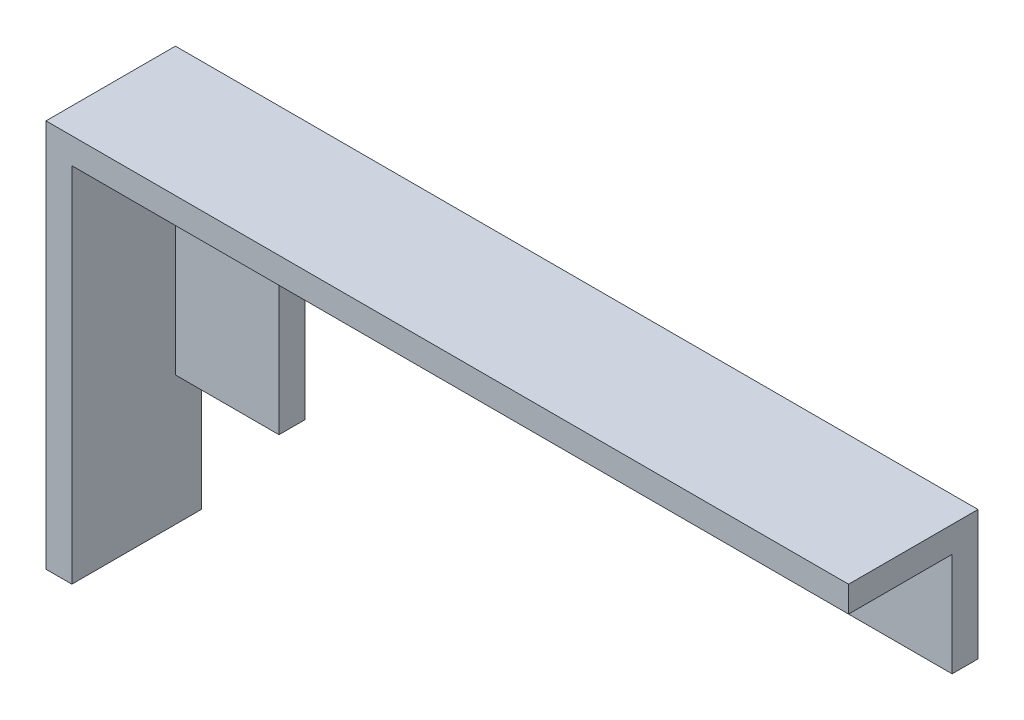
ISO-10303-21;
HEADER;
FILE_DESCRIPTION(('STEP AP214'),'2;1');
FILE_NAME('part.step','',(''),(''),'','','');
FILE_SCHEMA(('AUTOMOTIVE_DESIGN { 1 0 10303 214 1 1 1 1 }'));
ENDSEC;
DATA;
#1=APPLICATION_CONTEXT('core data for automotive mechanical design processes');
#2=APPLICATION_PROTOCOL_DEFINITION('international standard','automotive_design',2000,#1);
#3=PRODUCT_CONTEXT('',#1,'mechanical');
#4=PRODUCT('Part','Part','',(#3));
#5=PRODUCT_RELATED_PRODUCT_CATEGORY('part','',(#4));
#6=PRODUCT_DEFINITION_FORMATION('','',#4);
#7=PRODUCT_DEFINITION_CONTEXT('part definition',#1,'design');
#8=PRODUCT_DEFINITION('design','',#6,#7);
#9=PRODUCT_DEFINITION_SHAPE('','',#8);
#10=(LENGTH_UNIT() NAMED_UNIT(*) SI_UNIT(.MILLI.,.METRE.));
#11=(NAMED_UNIT(*) PLANE_ANGLE_UNIT() SI_UNIT($,.RADIAN.));
#12=(NAMED_UNIT(*) SI_UNIT($,.STERADIAN.) SOLID_ANGLE_UNIT());
#13=UNCERTAINTY_MEASURE_WITH_UNIT(LENGTH_MEASURE(1.E-05),#10,'distance_accuracy_value','');
#14=(GEOMETRIC_REPRESENTATION_CONTEXT(3) GLOBAL_UNCERTAINTY_ASSIGNED_CONTEXT((#13)) GLOBAL_UNIT_ASSIGNED_CONTEXT((#10,
#11,#12)) REPRESENTATION_CONTEXT('',''));
#15=CARTESIAN_POINT('',(0.,0.,0.));
#16=DIRECTION('',(0.,0.,1.));
#17=DIRECTION('',(1.,0.,0.));
#18=AXIS2_PLACEMENT_3D('',#15,#16,#17);
#19=CARTESIAN_POINT('',(0.,0.,5.));
#20=DIRECTION('',(1.,0.,0.));
#21=DIRECTION('',(0.,1.,0.));
#22=AXIS2_PLACEMENT_3D('',#19,#20,#21);
#23=PLANE('',#22);
#24=DIRECTION('',(0.,-1.,0.));
#25=VECTOR('',#24,1.);
#26=CARTESIAN_POINT('',(0.,0.,0.));
#27=LINE('',#26,#25);
#28=CARTESIAN_POINT('',(0.,0.,0.));
#29=VERTEX_POINT('',#28);
#30=CARTESIAN_POINT('',(0.,-15.,0.));
#31=VERTEX_POINT('',#30);
#32=EDGE_CURVE('E182',#29,#31,#27,.T.);
#33=ORIENTED_EDGE('',*,*,#32,.T.);
#34=DIRECTION('',(0.,0.,-1.));
#35=VECTOR('',#34,1.);
#36=CARTESIAN_POINT('',(0.,-15.,5.));
#37=LINE('',#36,#35);
#38=CARTESIAN_POINT('',(0.,-15.,5.));
#39=VERTEX_POINT('',#38);
#40=EDGE_CURVE('E11',#39,#31,#37,.T.);
#41=ORIENTED_EDGE('',*,*,#40,.F.);
#42=DIRECTION('',(0.,-1.,0.));
#43=VECTOR('',#42,1.);
#44=CARTESIAN_POINT('',(0.,0.,5.));
#45=LINE('',#44,#43);
#46=CARTESIAN_POINT('',(0.,0.,5.));
#47=VERTEX_POINT('',#46);
#48=EDGE_CURVE('E197',#47,#39,#45,.T.);
#49=ORIENTED_EDGE('',*,*,#48,.F.);
#50=DIRECTION('',(0.,0.,-1.));
#51=VECTOR('',#50,1.);
#52=CARTESIAN_POINT('',(0.,0.,5.));
#53=LINE('',#52,#51);
#54=EDGE_CURVE('E198',#47,#29,#53,.T.);
#55=ORIENTED_EDGE('',*,*,#54,.T.);
#56=EDGE_LOOP('',(#33,#41,#49,#55));
#57=FACE_BOUND('',#56,.T.);
#58=ADVANCED_FACE('F39',(#57),#23,.F.);
#59=CARTESIAN_POINT('',(0.,-15.,5.));
#60=DIRECTION('',(0.,1.,0.));
#61=DIRECTION('',(0.,0.,1.));
#62=AXIS2_PLACEMENT_3D('',#59,#60,#61);
#63=PLANE('',#62);
#64=DIRECTION('',(1.,0.,0.));
#65=VECTOR('',#64,1.);
#66=CARTESIAN_POINT('',(0.,-15.,0.));
#67=LINE('',#66,#65);
#68=CARTESIAN_POINT('',(1.,-15.,0.));
#69=VERTEX_POINT('',#68);
#70=EDGE_CURVE('E175',#31,#69,#67,.T.);
#71=ORIENTED_EDGE('',*,*,#70,.T.);
#72=DIRECTION('',(0.,0.,-1.));
#73=VECTOR('',#72,1.);
#74=CARTESIAN_POINT('',(1.,-15.,5.));
#75=LINE('',#74,#73);
#76=CARTESIAN_POINT('',(1.,-15.,5.));
#77=VERTEX_POINT('',#76);
#78=EDGE_CURVE('E47',#77,#69,#75,.T.);
#79=ORIENTED_EDGE('',*,*,#78,.F.);
#80=DIRECTION('',(1.,0.,0.));
#81=VECTOR('',#80,1.);
#82=CARTESIAN_POINT('',(0.,-15.,5.));
#83=LINE('',#82,#81);
#84=EDGE_CURVE('E103',#39,#77,#83,.T.);
#85=ORIENTED_EDGE('',*,*,#84,.F.);
#86=ORIENTED_EDGE('',*,*,#40,.T.);
#87=EDGE_LOOP('',(#71,#79,#85,#86));
#88=FACE_BOUND('',#87,.T.);
#89=ADVANCED_FACE('F259',(#88),#63,.F.);
#90=CARTESIAN_POINT('',(1.,-15.,5.));
#91=DIRECTION('',(-1.,0.,0.));
#92=DIRECTION('',(0.,0.,1.));
#93=AXIS2_PLACEMENT_3D('',#90,#91,#92);
#94=PLANE('',#93);
#95=DIRECTION('',(0.,1.,0.));
#96=VECTOR('',#95,1.);
#97=CARTESIAN_POINT('',(1.,-15.,0.));
#98=LINE('',#97,#96);
#99=CARTESIAN_POINT('',(1.,-10.,0.));
#100=VERTEX_POINT('',#99);
#101=EDGE_CURVE('E169',#69,#100,#98,.T.);
#102=ORIENTED_EDGE('',*,*,#101,.T.);
#103=DIRECTION('',(0.,0.,-1.));
#104=VECTOR('',#103,1.);
#105=CARTESIAN_POINT('',(1.,-10.,5.));
#106=LINE('',#105,#104);
#107=CARTESIAN_POINT('',(1.,-10.,1.));
#108=VERTEX_POINT('',#107);
#109=EDGE_CURVE('E154',#108,#100,#106,.T.);
#110=ORIENTED_EDGE('',*,*,#109,.F.);
#111=DIRECTION('',(0.,-1.,0.));
#112=VECTOR('',#111,1.);
#113=CARTESIAN_POINT('',(1.,-10.,1.));
#114=LINE('',#113,#112);
#115=CARTESIAN_POINT('',(1.,-1.,1.));
#116=VERTEX_POINT('',#115);
#117=EDGE_CURVE('E132',#116,#108,#114,.T.);
#118=ORIENTED_EDGE('',*,*,#117,.F.);
#119=DIRECTION('',(0.,0.,1.));
#120=VECTOR('',#119,1.);
#121=CARTESIAN_POINT('',(1.,-1.,1.));
#122=LINE('',#121,#120);
#123=CARTESIAN_POINT('',(1.,-1.,5.));
#124=VERTEX_POINT('',#123);
#125=EDGE_CURVE('E220',#116,#124,#122,.T.);
#126=ORIENTED_EDGE('',*,*,#125,.T.);
#127=DIRECTION('',(0.,1.,0.));
#128=VECTOR('',#127,1.);
#129=CARTESIAN_POINT('',(1.,-15.,5.));
#130=LINE('',#129,#128);
#131=EDGE_CURVE('E171',#77,#124,#130,.T.);
#132=ORIENTED_EDGE('',*,*,#131,.F.);
#133=ORIENTED_EDGE('',*,*,#78,.T.);
#134=EDGE_LOOP('',(#102,#110,#118,#126,#132,#133));
#135=FACE_BOUND('',#134,.T.);
#136=ADVANCED_FACE('F168',(#135),#94,.F.);
#137=CARTESIAN_POINT('',(1.,-10.,5.));
#138=DIRECTION('',(0.,1.,0.));
#139=DIRECTION('',(0.,0.,1.));
#140=AXIS2_PLACEMENT_3D('',#137,#138,#139);
#141=PLANE('',#140);
#142=DIRECTION('',(0.,0.,-1.));
#143=VECTOR('',#142,1.);
#144=CARTESIAN_POINT('',(5.,-10.,5.));
#145=LINE('',#144,#143);
#146=CARTESIAN_POINT('',(5.,-10.,1.));
#147=VERTEX_POINT('',#146);
#148=CARTESIAN_POINT('',(5.,-10.,0.));
#149=VERTEX_POINT('',#148);
#150=EDGE_CURVE('E143',#147,#149,#145,.T.);
#151=ORIENTED_EDGE('',*,*,#150,.F.);
#152=DIRECTION('',(1.,0.,0.));
#153=VECTOR('',#152,1.);
#154=CARTESIAN_POINT('',(5.,-10.,1.));
#155=LINE('',#154,#153);
#156=EDGE_CURVE('E125',#108,#147,#155,.T.);
#157=ORIENTED_EDGE('',*,*,#156,.F.);
#158=ORIENTED_EDGE('',*,*,#109,.T.);
#159=DIRECTION('',(1.,0.,0.));
#160=VECTOR('',#159,1.);
#161=CARTESIAN_POINT('',(1.,-10.,0.));
#162=LINE('',#161,#160);
#163=EDGE_CURVE('E151',#100,#149,#162,.T.);
#164=ORIENTED_EDGE('',*,*,#163,.T.);
#165=EDGE_LOOP('',(#151,#157,#158,#164));
#166=FACE_BOUND('',#165,.T.);
#167=ADVANCED_FACE('F149',(#166),#141,.F.);
#168=CARTESIAN_POINT('',(5.,-10.,5.));
#169=DIRECTION('',(-1.,0.,0.));
#170=DIRECTION('',(0.,-1.,0.));
#171=AXIS2_PLACEMENT_3D('',#168,#169,#170);
#172=PLANE('',#171);
#173=DIRECTION('',(0.,0.,-1.));
#174=VECTOR('',#173,1.);
#175=CARTESIAN_POINT('',(5.,-5.,5.));
#176=LINE('',#175,#174);
#177=CARTESIAN_POINT('',(5.,-5.,1.));
#178=VERTEX_POINT('',#177);
#179=CARTESIAN_POINT('',(5.,-5.,0.));
#180=VERTEX_POINT('',#179);
#181=EDGE_CURVE('E145',#178,#180,#176,.T.);
#182=ORIENTED_EDGE('',*,*,#181,.F.);
#183=DIRECTION('',(0.,1.,0.));
#184=VECTOR('',#183,1.);
#185=CARTESIAN_POINT('',(5.,-5.,1.));
#186=LINE('',#185,#184);
#187=EDGE_CURVE('E128',#147,#178,#186,.T.);
#188=ORIENTED_EDGE('',*,*,#187,.F.);
#189=ORIENTED_EDGE('',*,*,#150,.T.);
#190=DIRECTION('',(0.,1.,0.));
#191=VECTOR('',#190,1.);
#192=CARTESIAN_POINT('',(5.,-10.,0.));
#193=LINE('',#192,#191);
#194=EDGE_CURVE('E180',#149,#180,#193,.T.);
#195=ORIENTED_EDGE('',*,*,#194,.T.);
#196=EDGE_LOOP('',(#182,#188,#189,#195));
#197=FACE_BOUND('',#196,.T.);
#198=ADVANCED_FACE('F141',(#197),#172,.F.);
#199=CARTESIAN_POINT('',(31.,-5.,5.));
#200=DIRECTION('',(0.,1.,0.));
#201=DIRECTION('',(-1.,0.,0.));
#202=AXIS2_PLACEMENT_3D('',#199,#200,#201);
#203=PLANE('',#202);
#204=DIRECTION('',(0.,0.,-1.));
#205=VECTOR('',#204,1.);
#206=CARTESIAN_POINT('',(31.,-5.,5.));
#207=LINE('',#206,#205);
#208=CARTESIAN_POINT('',(31.,-5.,1.));
#209=VERTEX_POINT('',#208);
#210=CARTESIAN_POINT('',(31.,-5.,0.));
#211=VERTEX_POINT('',#210);
#212=EDGE_CURVE('E159',#209,#211,#207,.T.);
#213=ORIENTED_EDGE('',*,*,#212,.F.);
#214=DIRECTION('',(1.,0.,0.));
#215=VECTOR('',#214,1.);
#216=CARTESIAN_POINT('',(31.,-5.,1.));
#217=LINE('',#216,#215);
#218=EDGE_CURVE('E147',#178,#209,#217,.T.);
#219=ORIENTED_EDGE('',*,*,#218,.F.);
#220=ORIENTED_EDGE('',*,*,#181,.T.);
#221=DIRECTION('',(1.,0.,0.));
#222=VECTOR('',#221,1.);
#223=CARTESIAN_POINT('',(31.,-5.,0.));
#224=LINE('',#223,#222);
#225=EDGE_CURVE('E188',#180,#211,#224,.T.);
#226=ORIENTED_EDGE('',*,*,#225,.T.);
#227=EDGE_LOOP('',(#213,#219,#220,#226));
#228=FACE_BOUND('',#227,.T.);
#229=ADVANCED_FACE('F215',(#228),#203,.F.);
#230=CARTESIAN_POINT('',(31.,0.,5.));
#231=DIRECTION('',(-1.,0.,0.));
#232=DIRECTION('',(0.,-1.,0.));
#233=AXIS2_PLACEMENT_3D('',#230,#231,#232);
#234=PLANE('',#233);
#235=DIRECTION('',(0.,1.,0.));
#236=VECTOR('',#235,1.);
#237=CARTESIAN_POINT('',(31.,0.,5.));
#238=LINE('',#237,#236);
#239=CARTESIAN_POINT('',(31.,-1.,5.));
#240=VERTEX_POINT('',#239);
#241=CARTESIAN_POINT('',(31.,0.,5.));
#242=VERTEX_POINT('',#241);
#243=EDGE_CURVE('E226',#240,#242,#238,.T.);
#244=ORIENTED_EDGE('',*,*,#243,.F.);
#245=DIRECTION('',(0.,0.,1.));
#246=VECTOR('',#245,1.);
#247=CARTESIAN_POINT('',(31.,-1.,1.));
#248=LINE('',#247,#246);
#249=CARTESIAN_POINT('',(31.,-1.,1.));
#250=VERTEX_POINT('',#249);
#251=EDGE_CURVE('E54',#250,#240,#248,.T.);
#252=ORIENTED_EDGE('',*,*,#251,.F.);
#253=DIRECTION('',(0.,1.,0.));
#254=VECTOR('',#253,1.);
#255=CARTESIAN_POINT('',(31.,-1.,1.));
#256=LINE('',#255,#254);
#257=EDGE_CURVE('E212',#209,#250,#256,.T.);
#258=ORIENTED_EDGE('',*,*,#257,.F.);
#259=ORIENTED_EDGE('',*,*,#212,.T.);
#260=DIRECTION('',(0.,1.,0.));
#261=VECTOR('',#260,1.);
#262=CARTESIAN_POINT('',(31.,0.,0.));
#263=LINE('',#262,#261);
#264=CARTESIAN_POINT('',(31.,0.,0.));
#265=VERTEX_POINT('',#264);
#266=EDGE_CURVE('E192',#211,#265,#263,.T.);
#267=ORIENTED_EDGE('',*,*,#266,.T.);
#268=DIRECTION('',(0.,0.,-1.));
#269=VECTOR('',#268,1.);
#270=CARTESIAN_POINT('',(31.,0.,5.));
#271=LINE('',#270,#269);
#272=EDGE_CURVE('E201',#242,#265,#271,.T.);
#273=ORIENTED_EDGE('',*,*,#272,.F.);
#274=EDGE_LOOP('',(#244,#252,#258,#259,#267,#273));
#275=FACE_BOUND('',#274,.T.);
#276=ADVANCED_FACE('F208',(#275),#234,.F.);
#277=CARTESIAN_POINT('',(0.,0.,5.));
#278=DIRECTION('',(0.,-1.,0.));
#279=DIRECTION('',(0.,0.,-1.));
#280=AXIS2_PLACEMENT_3D('',#277,#278,#279);
#281=PLANE('',#280);
#282=DIRECTION('',(-1.,0.,0.));
#283=VECTOR('',#282,1.);
#284=CARTESIAN_POINT('',(0.,0.,0.));
#285=LINE('',#284,#283);
#286=EDGE_CURVE('E96',#265,#29,#285,.T.);
#287=ORIENTED_EDGE('',*,*,#286,.T.);
#288=ORIENTED_EDGE('',*,*,#54,.F.);
#289=DIRECTION('',(-1.,0.,0.));
#290=VECTOR('',#289,1.);
#291=CARTESIAN_POINT('',(0.,0.,5.));
#292=LINE('',#291,#290);
#293=EDGE_CURVE('E63',#242,#47,#292,.T.);
#294=ORIENTED_EDGE('',*,*,#293,.F.);
#295=ORIENTED_EDGE('',*,*,#272,.T.);
#296=EDGE_LOOP('',(#287,#288,#294,#295));
#297=FACE_BOUND('',#296,.T.);
#298=ADVANCED_FACE('F276',(#297),#281,.F.);
#299=CARTESIAN_POINT('',(0.,0.,5.));
#300=DIRECTION('',(0.,0.,1.));
#301=DIRECTION('',(1.,0.,0.));
#302=AXIS2_PLACEMENT_3D('',#299,#300,#301);
#303=PLANE('',#302);
#304=ORIENTED_EDGE('',*,*,#131,.T.);
#305=DIRECTION('',(-1.,0.,0.));
#306=VECTOR('',#305,1.);
#307=CARTESIAN_POINT('',(1.,-1.,5.));
#308=LINE('',#307,#306);
#309=EDGE_CURVE('E137',#240,#124,#308,.T.);
#310=ORIENTED_EDGE('',*,*,#309,.F.);
#311=ORIENTED_EDGE('',*,*,#243,.T.);
#312=ORIENTED_EDGE('',*,*,#293,.T.);
#313=ORIENTED_EDGE('',*,*,#48,.T.);
#314=ORIENTED_EDGE('',*,*,#84,.T.);
#315=EDGE_LOOP('',(#304,#310,#311,#312,#313,#314));
#316=FACE_BOUND('',#315,.T.);
#317=ADVANCED_FACE('F247',(#316),#303,.T.);
#318=CARTESIAN_POINT('',(0.,0.,0.));
#319=DIRECTION('',(0.,0.,1.));
#320=DIRECTION('',(1.,0.,0.));
#321=AXIS2_PLACEMENT_3D('',#318,#319,#320);
#322=PLANE('',#321);
#323=ORIENTED_EDGE('',*,*,#32,.F.);
#324=ORIENTED_EDGE('',*,*,#286,.F.);
#325=ORIENTED_EDGE('',*,*,#266,.F.);
#326=ORIENTED_EDGE('',*,*,#225,.F.);
#327=ORIENTED_EDGE('',*,*,#194,.F.);
#328=ORIENTED_EDGE('',*,*,#163,.F.);
#329=ORIENTED_EDGE('',*,*,#101,.F.);
#330=ORIENTED_EDGE('',*,*,#70,.F.);
#331=EDGE_LOOP('',(#323,#324,#325,#326,#327,#328,#329,#330));
#332=FACE_BOUND('',#331,.T.);
#333=ADVANCED_FACE('F174',(#332),#322,.F.);
#334=CARTESIAN_POINT('',(1.,-1.,1.));
#335=DIRECTION('',(0.,1.,0.));
#336=DIRECTION('',(0.,0.,1.));
#337=AXIS2_PLACEMENT_3D('',#334,#335,#336);
#338=PLANE('',#337);
#339=ORIENTED_EDGE('',*,*,#309,.T.);
#340=ORIENTED_EDGE('',*,*,#125,.F.);
#341=DIRECTION('',(-1.,0.,0.));
#342=VECTOR('',#341,1.);
#343=CARTESIAN_POINT('',(1.,-1.,1.));
#344=LINE('',#343,#342);
#345=EDGE_CURVE('E241',#250,#116,#344,.T.);
#346=ORIENTED_EDGE('',*,*,#345,.F.);
#347=ORIENTED_EDGE('',*,*,#251,.T.);
#348=EDGE_LOOP('',(#339,#340,#346,#347));
#349=FACE_BOUND('',#348,.T.);
#350=ADVANCED_FACE('F248',(#349),#338,.F.);
#351=CARTESIAN_POINT('',(0.,0.,1.));
#352=DIRECTION('',(0.,0.,-1.));
#353=DIRECTION('',(-1.,0.,0.));
#354=AXIS2_PLACEMENT_3D('',#351,#352,#353);
#355=PLANE('',#354);
#356=ORIENTED_EDGE('',*,*,#156,.T.);
#357=ORIENTED_EDGE('',*,*,#187,.T.);
#358=ORIENTED_EDGE('',*,*,#218,.T.);
#359=ORIENTED_EDGE('',*,*,#257,.T.);
#360=ORIENTED_EDGE('',*,*,#345,.T.);
#361=ORIENTED_EDGE('',*,*,#117,.T.);
#362=EDGE_LOOP('',(#356,#357,#358,#359,#360,#361));
#363=FACE_BOUND('',#362,.T.);
#364=ADVANCED_FACE('F127',(#363),#355,.F.);
#365=CLOSED_SHELL('',(#58,#89,#136,#167,#198,#229,#276,#298,#317,#333,#350,#364));
#366=MANIFOLD_SOLID_BREP('B2',#365);
#367=ADVANCED_BREP_SHAPE_REPRESENTATION('',(#18,#366),#14);
#368=SHAPE_DEFINITION_REPRESENTATION(#9,#367);
ENDSEC;
END-ISO-10303-21;
